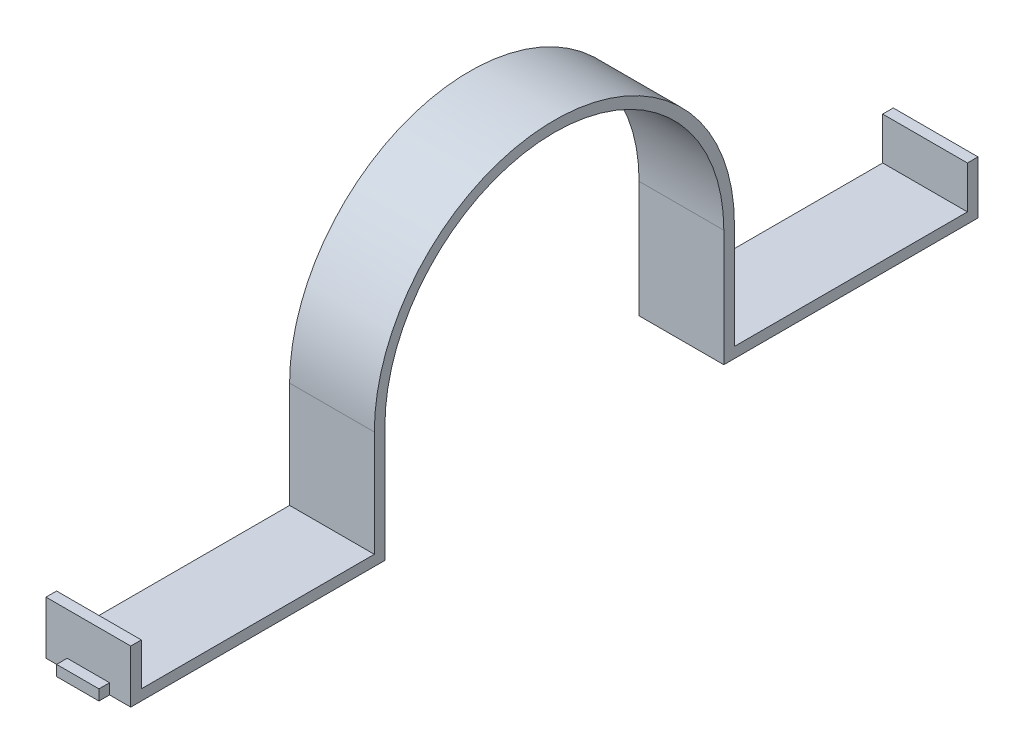
ISO-10303-21;
HEADER;
FILE_DESCRIPTION(('STEP AP214'),'2;1');
FILE_NAME('part.step','',(''),(''),'','','');
FILE_SCHEMA(('AUTOMOTIVE_DESIGN { 1 0 10303 214 1 1 1 1 }'));
ENDSEC;
DATA;
#1=APPLICATION_CONTEXT('core data for automotive mechanical design processes');
#2=APPLICATION_PROTOCOL_DEFINITION('international standard','automotive_design',2000,#1);
#3=PRODUCT_CONTEXT('',#1,'mechanical');
#4=PRODUCT('Part','Part','',(#3));
#5=PRODUCT_RELATED_PRODUCT_CATEGORY('part','',(#4));
#6=PRODUCT_DEFINITION_FORMATION('','',#4);
#7=PRODUCT_DEFINITION_CONTEXT('part definition',#1,'design');
#8=PRODUCT_DEFINITION('design','',#6,#7);
#9=PRODUCT_DEFINITION_SHAPE('','',#8);
#10=(LENGTH_UNIT() NAMED_UNIT(*) SI_UNIT(.MILLI.,.METRE.));
#11=(NAMED_UNIT(*) PLANE_ANGLE_UNIT() SI_UNIT($,.RADIAN.));
#12=(NAMED_UNIT(*) SI_UNIT($,.STERADIAN.) SOLID_ANGLE_UNIT());
#13=UNCERTAINTY_MEASURE_WITH_UNIT(LENGTH_MEASURE(1.E-05),#10,'distance_accuracy_value','');
#14=(GEOMETRIC_REPRESENTATION_CONTEXT(3) GLOBAL_UNCERTAINTY_ASSIGNED_CONTEXT((#13)) GLOBAL_UNIT_ASSIGNED_CONTEXT((#10,
#11,#12)) REPRESENTATION_CONTEXT('',''));
#15=CARTESIAN_POINT('',(0.,0.,0.));
#16=DIRECTION('',(0.,0.,1.));
#17=DIRECTION('',(1.,0.,0.));
#18=AXIS2_PLACEMENT_3D('',#15,#16,#17);
#19=CARTESIAN_POINT('',(-25.4,-63.5,254.002));
#20=DIRECTION('',(0.,-1.,0.));
#21=DIRECTION('',(0.,0.,-1.));
#22=AXIS2_PLACEMENT_3D('',#19,#20,#21);
#23=PLANE('',#22);
#24=DIRECTION('',(0.,0.,-1.));
#25=VECTOR('',#24,1.);
#26=CARTESIAN_POINT('',(25.4,-63.5,254.002));
#27=LINE('',#26,#25);
#28=CARTESIAN_POINT('',(25.4,-63.5,-107.95));
#29=VERTEX_POINT('',#28);
#30=CARTESIAN_POINT('',(25.4,-63.5,-247.65));
#31=VERTEX_POINT('',#30);
#32=EDGE_CURVE('E55',#29,#31,#27,.T.);
#33=ORIENTED_EDGE('',*,*,#32,.T.);
#34=DIRECTION('',(-1.,0.,0.));
#35=VECTOR('',#34,1.);
#36=CARTESIAN_POINT('',(-25.4,-63.5,-247.65));
#37=LINE('',#36,#35);
#38=CARTESIAN_POINT('',(-25.4,-63.5,-247.65));
#39=VERTEX_POINT('',#38);
#40=EDGE_CURVE('E50',#31,#39,#37,.T.);
#41=ORIENTED_EDGE('',*,*,#40,.T.);
#42=DIRECTION('',(0.,0.,-1.));
#43=VECTOR('',#42,1.);
#44=CARTESIAN_POINT('',(-25.4,-63.5,254.002));
#45=LINE('',#44,#43);
#46=CARTESIAN_POINT('',(-25.4,-63.5,-107.95));
#47=VERTEX_POINT('',#46);
#48=EDGE_CURVE('E203',#47,#39,#45,.T.);
#49=ORIENTED_EDGE('',*,*,#48,.F.);
#50=DIRECTION('',(-1.,0.,0.));
#51=VECTOR('',#50,1.);
#52=CARTESIAN_POINT('',(-25.4,-63.5,-107.95));
#53=LINE('',#52,#51);
#54=EDGE_CURVE('E296',#29,#47,#53,.T.);
#55=ORIENTED_EDGE('',*,*,#54,.F.);
#56=EDGE_LOOP('',(#33,#41,#49,#55));
#57=FACE_BOUND('',#56,.T.);
#58=ADVANCED_FACE('F35',(#57),#23,.F.);
#59=CARTESIAN_POINT('',(-25.4,-63.5,-107.952));
#60=DIRECTION('',(0.,1.,0.));
#61=DIRECTION('',(0.,0.,1.));
#62=AXIS2_PLACEMENT_3D('',#59,#60,#61);
#63=PLANE('',#62);
#64=DIRECTION('',(0.,0.,-1.));
#65=VECTOR('',#64,1.);
#66=CARTESIAN_POINT('',(12.7,-63.5,254.));
#67=LINE('',#66,#65);
#68=CARTESIAN_POINT('',(12.7,-63.5,260.35));
#69=VERTEX_POINT('',#68);
#70=CARTESIAN_POINT('',(12.7,-63.5,254.));
#71=VERTEX_POINT('',#70);
#72=EDGE_CURVE('E283',#69,#71,#67,.T.);
#73=ORIENTED_EDGE('',*,*,#72,.T.);
#74=DIRECTION('',(-1.,0.,0.));
#75=VECTOR('',#74,1.);
#76=CARTESIAN_POINT('',(-25.4,-63.5,254.));
#77=LINE('',#76,#75);
#78=CARTESIAN_POINT('',(-12.7,-63.5,254.));
#79=VERTEX_POINT('',#78);
#80=EDGE_CURVE('E11',#71,#79,#77,.T.);
#81=ORIENTED_EDGE('',*,*,#80,.T.);
#82=DIRECTION('',(0.,0.,1.));
#83=VECTOR('',#82,1.);
#84=CARTESIAN_POINT('',(-12.7,-63.5,254.));
#85=LINE('',#84,#83);
#86=CARTESIAN_POINT('',(-12.7,-63.5,260.35));
#87=VERTEX_POINT('',#86);
#88=EDGE_CURVE('E255',#79,#87,#85,.T.);
#89=ORIENTED_EDGE('',*,*,#88,.T.);
#90=DIRECTION('',(1.,0.,0.));
#91=VECTOR('',#90,1.);
#92=CARTESIAN_POINT('',(-12.7,-63.5,260.35));
#93=LINE('',#92,#91);
#94=EDGE_CURVE('E280',#87,#69,#93,.T.);
#95=ORIENTED_EDGE('',*,*,#94,.T.);
#96=EDGE_LOOP('',(#73,#81,#89,#95));
#97=FACE_BOUND('',#96,.T.);
#98=ADVANCED_FACE('F452',(#97),#63,.T.);
#99=DIRECTION('',(0.,0.,1.));
#100=VECTOR('',#99,1.);
#101=CARTESIAN_POINT('',(-25.4,-63.5,-107.952));
#102=LINE('',#101,#100);
#103=CARTESIAN_POINT('',(-25.4,-63.5,107.95));
#104=VERTEX_POINT('',#103);
#105=CARTESIAN_POINT('',(-25.4,-63.5,247.65));
#106=VERTEX_POINT('',#105);
#107=EDGE_CURVE('E322',#104,#106,#102,.T.);
#108=ORIENTED_EDGE('',*,*,#107,.T.);
#109=DIRECTION('',(-1.,0.,0.));
#110=VECTOR('',#109,1.);
#111=CARTESIAN_POINT('',(-25.4,-63.5,247.65));
#112=LINE('',#111,#110);
#113=CARTESIAN_POINT('',(25.4,-63.5,247.65));
#114=VERTEX_POINT('',#113);
#115=EDGE_CURVE('E206',#114,#106,#112,.T.);
#116=ORIENTED_EDGE('',*,*,#115,.F.);
#117=DIRECTION('',(0.,0.,1.));
#118=VECTOR('',#117,1.);
#119=CARTESIAN_POINT('',(25.4,-63.5,-107.952));
#120=LINE('',#119,#118);
#121=CARTESIAN_POINT('',(25.4,-63.5,107.95));
#122=VERTEX_POINT('',#121);
#123=EDGE_CURVE('E312',#122,#114,#120,.T.);
#124=ORIENTED_EDGE('',*,*,#123,.F.);
#125=DIRECTION('',(-1.,0.,0.));
#126=VECTOR('',#125,1.);
#127=CARTESIAN_POINT('',(-25.4,-63.5,107.95));
#128=LINE('',#127,#126);
#129=EDGE_CURVE('E299',#122,#104,#128,.T.);
#130=ORIENTED_EDGE('',*,*,#129,.T.);
#131=EDGE_LOOP('',(#108,#116,#124,#130));
#132=FACE_BOUND('',#131,.T.);
#133=ADVANCED_FACE('F438',(#132),#63,.T.);
#134=CARTESIAN_POINT('',(25.4,-69.85,-107.95));
#135=DIRECTION('',(0.,0.,1.));
#136=DIRECTION('',(0.,-1.,0.));
#137=AXIS2_PLACEMENT_3D('',#134,#135,#136);
#138=PLANE('',#137);
#139=ORIENTED_EDGE('',*,*,#54,.T.);
#140=DIRECTION('',(0.,1.,0.));
#141=VECTOR('',#140,1.);
#142=CARTESIAN_POINT('',(-25.4,-69.85,-107.95));
#143=LINE('',#142,#141);
#144=CARTESIAN_POINT('',(-25.4,0.,-107.95));
#145=VERTEX_POINT('',#144);
#146=EDGE_CURVE('E354',#47,#145,#143,.T.);
#147=ORIENTED_EDGE('',*,*,#146,.T.);
#148=DIRECTION('',(-1.,0.,0.));
#149=VECTOR('',#148,1.);
#150=CARTESIAN_POINT('',(25.4,0.,-107.95));
#151=LINE('',#150,#149);
#152=CARTESIAN_POINT('',(25.4,0.,-107.95));
#153=VERTEX_POINT('',#152);
#154=EDGE_CURVE('E371',#153,#145,#151,.T.);
#155=ORIENTED_EDGE('',*,*,#154,.F.);
#156=DIRECTION('',(0.,1.,0.));
#157=VECTOR('',#156,1.);
#158=CARTESIAN_POINT('',(25.4,-69.85,-107.95));
#159=LINE('',#158,#157);
#160=EDGE_CURVE('E336',#29,#153,#159,.T.);
#161=ORIENTED_EDGE('',*,*,#160,.F.);
#162=EDGE_LOOP('',(#139,#147,#155,#161));
#163=FACE_BOUND('',#162,.T.);
#164=ADVANCED_FACE('F450',(#163),#138,.F.);
#165=CARTESIAN_POINT('',(25.4,0.,0.));
#166=DIRECTION('',(-1.,0.,0.));
#167=DIRECTION('',(0.,0.,1.));
#168=AXIS2_PLACEMENT_3D('',#165,#166,#167);
#169=CYLINDRICAL_SURFACE('',#168,101.6);
#170=CARTESIAN_POINT('',(-25.4,0.,0.));
#171=DIRECTION('',(-1.,0.,0.));
#172=DIRECTION('',(0.,0.,1.));
#173=AXIS2_PLACEMENT_3D('',#170,#171,#172);
#174=CIRCLE('',#173,101.6);
#175=CARTESIAN_POINT('',(-25.4,0.,101.6));
#176=VERTEX_POINT('',#175);
#177=CARTESIAN_POINT('',(-25.4,0.,-101.6));
#178=VERTEX_POINT('',#177);
#179=EDGE_CURVE('E316',#176,#178,#174,.T.);
#180=ORIENTED_EDGE('',*,*,#179,.T.);
#181=DIRECTION('',(-1.,0.,0.));
#182=VECTOR('',#181,1.);
#183=CARTESIAN_POINT('',(25.4,0.,-101.6));
#184=LINE('',#183,#182);
#185=CARTESIAN_POINT('',(25.4,0.,-101.6));
#186=VERTEX_POINT('',#185);
#187=EDGE_CURVE('E43',#186,#178,#184,.T.);
#188=ORIENTED_EDGE('',*,*,#187,.F.);
#189=CARTESIAN_POINT('',(25.4,0.,0.));
#190=DIRECTION('',(-1.,0.,0.));
#191=DIRECTION('',(0.,0.,1.));
#192=AXIS2_PLACEMENT_3D('',#189,#190,#191);
#193=CIRCLE('',#192,101.6);
#194=CARTESIAN_POINT('',(25.4,0.,101.6));
#195=VERTEX_POINT('',#194);
#196=EDGE_CURVE('E327',#195,#186,#193,.T.);
#197=ORIENTED_EDGE('',*,*,#196,.F.);
#198=DIRECTION('',(-1.,0.,0.));
#199=VECTOR('',#198,1.);
#200=CARTESIAN_POINT('',(25.4,0.,101.6));
#201=LINE('',#200,#199);
#202=EDGE_CURVE('E347',#195,#176,#201,.T.);
#203=ORIENTED_EDGE('',*,*,#202,.T.);
#204=EDGE_LOOP('',(#180,#188,#197,#203));
#205=FACE_BOUND('',#204,.T.);
#206=ADVANCED_FACE('F37',(#205),#169,.F.);
#207=CARTESIAN_POINT('',(25.4,0.,-101.6));
#208=DIRECTION('',(0.,0.,-1.));
#209=DIRECTION('',(0.,1.,0.));
#210=AXIS2_PLACEMENT_3D('',#207,#208,#209);
#211=PLANE('',#210);
#212=DIRECTION('',(0.,-1.,0.));
#213=VECTOR('',#212,1.);
#214=CARTESIAN_POINT('',(-25.4,0.,-101.6));
#215=LINE('',#214,#213);
#216=CARTESIAN_POINT('',(-25.4,-69.85,-101.6));
#217=VERTEX_POINT('',#216);
#218=EDGE_CURVE('E350',#178,#217,#215,.T.);
#219=ORIENTED_EDGE('',*,*,#218,.T.);
#220=DIRECTION('',(-1.,0.,0.));
#221=VECTOR('',#220,1.);
#222=CARTESIAN_POINT('',(25.4,-69.85,-101.6));
#223=LINE('',#222,#221);
#224=CARTESIAN_POINT('',(25.4,-69.85,-101.6));
#225=VERTEX_POINT('',#224);
#226=EDGE_CURVE('E374',#225,#217,#223,.T.);
#227=ORIENTED_EDGE('',*,*,#226,.F.);
#228=DIRECTION('',(0.,-1.,0.));
#229=VECTOR('',#228,1.);
#230=CARTESIAN_POINT('',(25.4,0.,-101.6));
#231=LINE('',#230,#229);
#232=EDGE_CURVE('E330',#186,#225,#231,.T.);
#233=ORIENTED_EDGE('',*,*,#232,.F.);
#234=ORIENTED_EDGE('',*,*,#187,.T.);
#235=EDGE_LOOP('',(#219,#227,#233,#234));
#236=FACE_BOUND('',#235,.T.);
#237=ADVANCED_FACE('F379',(#236),#211,.F.);
#238=CARTESIAN_POINT('',(25.4,-69.85,-101.6));
#239=DIRECTION('',(0.,1.,0.));
#240=DIRECTION('',(0.,0.,1.));
#241=AXIS2_PLACEMENT_3D('',#238,#239,#240);
#242=PLANE('',#241);
#243=DIRECTION('',(0.,0.,-1.));
#244=VECTOR('',#243,1.);
#245=CARTESIAN_POINT('',(-25.4,-69.85,-101.6));
#246=LINE('',#245,#244);
#247=CARTESIAN_POINT('',(-25.4,-69.85,-254.));
#248=VERTEX_POINT('',#247);
#249=EDGE_CURVE('E352',#217,#248,#246,.T.);
#250=ORIENTED_EDGE('',*,*,#249,.T.);
#251=DIRECTION('',(1.,0.,0.));
#252=VECTOR('',#251,1.);
#253=CARTESIAN_POINT('',(-25.4,-69.85,-254.));
#254=LINE('',#253,#252);
#255=CARTESIAN_POINT('',(-12.7,-69.85,-254.));
#256=VERTEX_POINT('',#255);
#257=EDGE_CURVE('E302',#248,#256,#254,.T.);
#258=ORIENTED_EDGE('',*,*,#257,.T.);
#259=DIRECTION('',(0.,0.,1.));
#260=VECTOR('',#259,1.);
#261=CARTESIAN_POINT('',(-12.7,-69.85,-254.));
#262=LINE('',#261,#260);
#263=CARTESIAN_POINT('',(-12.7,-69.85,-260.35));
#264=VERTEX_POINT('',#263);
#265=EDGE_CURVE('E253',#264,#256,#262,.T.);
#266=ORIENTED_EDGE('',*,*,#265,.F.);
#267=DIRECTION('',(-1.,0.,0.));
#268=VECTOR('',#267,1.);
#269=CARTESIAN_POINT('',(-12.7,-69.85,-260.35));
#270=LINE('',#269,#268);
#271=CARTESIAN_POINT('',(12.7,-69.85,-260.35));
#272=VERTEX_POINT('',#271);
#273=EDGE_CURVE('E249',#272,#264,#270,.T.);
#274=ORIENTED_EDGE('',*,*,#273,.F.);
#275=DIRECTION('',(0.,0.,-1.));
#276=VECTOR('',#275,1.);
#277=CARTESIAN_POINT('',(12.7,-69.85,-254.));
#278=LINE('',#277,#276);
#279=CARTESIAN_POINT('',(12.7,-69.85,-254.));
#280=VERTEX_POINT('',#279);
#281=EDGE_CURVE('E246',#280,#272,#278,.T.);
#282=ORIENTED_EDGE('',*,*,#281,.F.);
#283=CARTESIAN_POINT('',(25.4,-69.85,-254.));
#284=VERTEX_POINT('',#283);
#285=EDGE_CURVE('E305',#280,#284,#254,.T.);
#286=ORIENTED_EDGE('',*,*,#285,.T.);
#287=DIRECTION('',(0.,0.,-1.));
#288=VECTOR('',#287,1.);
#289=CARTESIAN_POINT('',(25.4,-69.85,-101.6));
#290=LINE('',#289,#288);
#291=EDGE_CURVE('E333',#225,#284,#290,.T.);
#292=ORIENTED_EDGE('',*,*,#291,.F.);
#293=ORIENTED_EDGE('',*,*,#226,.T.);
#294=EDGE_LOOP('',(#250,#258,#266,#274,#282,#286,#292,#293));
#295=FACE_BOUND('',#294,.T.);
#296=ADVANCED_FACE('F388',(#295),#242,.F.);
#297=CARTESIAN_POINT('',(25.4,0.,0.));
#298=DIRECTION('',(-1.,0.,0.));
#299=DIRECTION('',(0.,0.,1.));
#300=AXIS2_PLACEMENT_3D('',#297,#298,#299);
#301=CYLINDRICAL_SURFACE('',#300,107.95);
#302=CARTESIAN_POINT('',(-25.4,0.,0.));
#303=DIRECTION('',(1.,0.,0.));
#304=DIRECTION('',(0.,0.,1.));
#305=AXIS2_PLACEMENT_3D('',#302,#303,#304);
#306=CIRCLE('',#305,107.95);
#307=CARTESIAN_POINT('',(-25.4,0.,107.95));
#308=VERTEX_POINT('',#307);
#309=EDGE_CURVE('E356',#145,#308,#306,.T.);
#310=ORIENTED_EDGE('',*,*,#309,.T.);
#311=DIRECTION('',(-1.,0.,0.));
#312=VECTOR('',#311,1.);
#313=CARTESIAN_POINT('',(25.4,0.,107.95));
#314=LINE('',#313,#312);
#315=CARTESIAN_POINT('',(25.4,0.,107.95));
#316=VERTEX_POINT('',#315);
#317=EDGE_CURVE('E368',#316,#308,#314,.T.);
#318=ORIENTED_EDGE('',*,*,#317,.F.);
#319=CARTESIAN_POINT('',(25.4,0.,0.));
#320=DIRECTION('',(1.,0.,0.));
#321=DIRECTION('',(0.,0.,1.));
#322=AXIS2_PLACEMENT_3D('',#319,#320,#321);
#323=CIRCLE('',#322,107.95);
#324=EDGE_CURVE('E338',#153,#316,#323,.T.);
#325=ORIENTED_EDGE('',*,*,#324,.F.);
#326=ORIENTED_EDGE('',*,*,#154,.T.);
#327=EDGE_LOOP('',(#310,#318,#325,#326));
#328=FACE_BOUND('',#327,.T.);
#329=ADVANCED_FACE('F447',(#328),#301,.T.);
#330=CARTESIAN_POINT('',(25.4,0.,107.95));
#331=DIRECTION('',(0.,0.,-1.));
#332=DIRECTION('',(-1.,0.,0.));
#333=AXIS2_PLACEMENT_3D('',#330,#331,#332);
#334=PLANE('',#333);
#335=DIRECTION('',(0.,-1.,0.));
#336=VECTOR('',#335,1.);
#337=CARTESIAN_POINT('',(-25.4,0.,107.95));
#338=LINE('',#337,#336);
#339=EDGE_CURVE('E358',#308,#104,#338,.T.);
#340=ORIENTED_EDGE('',*,*,#339,.T.);
#341=ORIENTED_EDGE('',*,*,#129,.F.);
#342=DIRECTION('',(0.,-1.,0.));
#343=VECTOR('',#342,1.);
#344=CARTESIAN_POINT('',(25.4,0.,107.95));
#345=LINE('',#344,#343);
#346=EDGE_CURVE('E340',#316,#122,#345,.T.);
#347=ORIENTED_EDGE('',*,*,#346,.F.);
#348=ORIENTED_EDGE('',*,*,#317,.T.);
#349=EDGE_LOOP('',(#340,#341,#347,#348));
#350=FACE_BOUND('',#349,.T.);
#351=ADVANCED_FACE('F442',(#350),#334,.F.);
#352=CARTESIAN_POINT('',(25.4,-69.85,107.95));
#353=DIRECTION('',(0.,1.,0.));
#354=DIRECTION('',(0.,0.,1.));
#355=AXIS2_PLACEMENT_3D('',#352,#353,#354);
#356=PLANE('',#355);
#357=DIRECTION('',(0.,0.,-1.));
#358=VECTOR('',#357,1.);
#359=CARTESIAN_POINT('',(-25.4,-69.85,107.95));
#360=LINE('',#359,#358);
#361=CARTESIAN_POINT('',(-25.4,-69.85,254.));
#362=VERTEX_POINT('',#361);
#363=CARTESIAN_POINT('',(-25.4,-69.85,101.6));
#364=VERTEX_POINT('',#363);
#365=EDGE_CURVE('E360',#362,#364,#360,.T.);
#366=ORIENTED_EDGE('',*,*,#365,.T.);
#367=DIRECTION('',(-1.,0.,0.));
#368=VECTOR('',#367,1.);
#369=CARTESIAN_POINT('',(25.4,-69.85,101.6));
#370=LINE('',#369,#368);
#371=CARTESIAN_POINT('',(25.4,-69.85,101.6));
#372=VERTEX_POINT('',#371);
#373=EDGE_CURVE('E365',#372,#364,#370,.T.);
#374=ORIENTED_EDGE('',*,*,#373,.F.);
#375=DIRECTION('',(0.,0.,-1.));
#376=VECTOR('',#375,1.);
#377=CARTESIAN_POINT('',(25.4,-69.85,107.95));
#378=LINE('',#377,#376);
#379=CARTESIAN_POINT('',(25.4,-69.85,254.));
#380=VERTEX_POINT('',#379);
#381=EDGE_CURVE('E343',#380,#372,#378,.T.);
#382=ORIENTED_EDGE('',*,*,#381,.F.);
#383=DIRECTION('',(1.,0.,0.));
#384=VECTOR('',#383,1.);
#385=CARTESIAN_POINT('',(-25.4,-69.85,254.));
#386=LINE('',#385,#384);
#387=CARTESIAN_POINT('',(12.7,-69.85,254.));
#388=VERTEX_POINT('',#387);
#389=EDGE_CURVE('E321',#388,#380,#386,.T.);
#390=ORIENTED_EDGE('',*,*,#389,.F.);
#391=DIRECTION('',(0.,0.,1.));
#392=VECTOR('',#391,1.);
#393=CARTESIAN_POINT('',(12.7,-69.85,254.));
#394=LINE('',#393,#392);
#395=CARTESIAN_POINT('',(12.7,-69.85,260.35));
#396=VERTEX_POINT('',#395);
#397=EDGE_CURVE('E271',#388,#396,#394,.T.);
#398=ORIENTED_EDGE('',*,*,#397,.T.);
#399=DIRECTION('',(-1.,0.,0.));
#400=VECTOR('',#399,1.);
#401=CARTESIAN_POINT('',(-12.7,-69.85,260.35));
#402=LINE('',#401,#400);
#403=CARTESIAN_POINT('',(-12.7,-69.85,260.35));
#404=VERTEX_POINT('',#403);
#405=EDGE_CURVE('E277',#396,#404,#402,.T.);
#406=ORIENTED_EDGE('',*,*,#405,.T.);
#407=DIRECTION('',(0.,0.,-1.));
#408=VECTOR('',#407,1.);
#409=CARTESIAN_POINT('',(-12.7,-69.85,254.));
#410=LINE('',#409,#408);
#411=CARTESIAN_POINT('',(-12.7,-69.85,254.));
#412=VERTEX_POINT('',#411);
#413=EDGE_CURVE('E273',#404,#412,#410,.T.);
#414=ORIENTED_EDGE('',*,*,#413,.T.);
#415=EDGE_CURVE('E319',#362,#412,#386,.T.);
#416=ORIENTED_EDGE('',*,*,#415,.F.);
#417=EDGE_LOOP('',(#366,#374,#382,#390,#398,#406,#414,#416));
#418=FACE_BOUND('',#417,.T.);
#419=ADVANCED_FACE('F419',(#418),#356,.F.);
#420=CARTESIAN_POINT('',(25.4,-69.85,101.6));
#421=DIRECTION('',(0.,0.,1.));
#422=DIRECTION('',(0.,-1.,0.));
#423=AXIS2_PLACEMENT_3D('',#420,#421,#422);
#424=PLANE('',#423);
#425=DIRECTION('',(0.,1.,0.));
#426=VECTOR('',#425,1.);
#427=CARTESIAN_POINT('',(-25.4,-69.85,101.6));
#428=LINE('',#427,#426);
#429=EDGE_CURVE('E331',#364,#176,#428,.T.);
#430=ORIENTED_EDGE('',*,*,#429,.T.);
#431=ORIENTED_EDGE('',*,*,#202,.F.);
#432=DIRECTION('',(0.,1.,0.));
#433=VECTOR('',#432,1.);
#434=CARTESIAN_POINT('',(25.4,-69.85,101.6));
#435=LINE('',#434,#433);
#436=EDGE_CURVE('E345',#372,#195,#435,.T.);
#437=ORIENTED_EDGE('',*,*,#436,.F.);
#438=ORIENTED_EDGE('',*,*,#373,.T.);
#439=EDGE_LOOP('',(#430,#431,#437,#438));
#440=FACE_BOUND('',#439,.T.);
#441=ADVANCED_FACE('F417',(#440),#424,.F.);
#442=CARTESIAN_POINT('',(25.4,0.,0.));
#443=DIRECTION('',(-1.,0.,0.));
#444=DIRECTION('',(0.,0.,1.));
#445=AXIS2_PLACEMENT_3D('',#442,#443,#444);
#446=PLANE('',#445);
#447=ORIENTED_EDGE('',*,*,#196,.T.);
#448=ORIENTED_EDGE('',*,*,#232,.T.);
#449=ORIENTED_EDGE('',*,*,#291,.T.);
#450=DIRECTION('',(0.,1.,0.));
#451=VECTOR('',#450,1.);
#452=CARTESIAN_POINT('',(25.4,-69.85,-254.));
#453=LINE('',#452,#451);
#454=CARTESIAN_POINT('',(25.4,-38.1,-254.));
#455=VERTEX_POINT('',#454);
#456=EDGE_CURVE('E300',#284,#455,#453,.T.);
#457=ORIENTED_EDGE('',*,*,#456,.T.);
#458=DIRECTION('',(0.,0.,1.));
#459=VECTOR('',#458,1.);
#460=CARTESIAN_POINT('',(25.4,-38.1,-254.));
#461=LINE('',#460,#459);
#462=CARTESIAN_POINT('',(25.4,-38.1,-247.65));
#463=VERTEX_POINT('',#462);
#464=EDGE_CURVE('E220',#455,#463,#461,.T.);
#465=ORIENTED_EDGE('',*,*,#464,.T.);
#466=DIRECTION('',(0.,-1.,0.));
#467=VECTOR('',#466,1.);
#468=CARTESIAN_POINT('',(25.4,-38.1,-247.65));
#469=LINE('',#468,#467);
#470=EDGE_CURVE('E207',#463,#31,#469,.T.);
#471=ORIENTED_EDGE('',*,*,#470,.T.);
#472=ORIENTED_EDGE('',*,*,#32,.F.);
#473=ORIENTED_EDGE('',*,*,#160,.T.);
#474=ORIENTED_EDGE('',*,*,#324,.T.);
#475=ORIENTED_EDGE('',*,*,#346,.T.);
#476=ORIENTED_EDGE('',*,*,#123,.T.);
#477=DIRECTION('',(0.,-1.,0.));
#478=VECTOR('',#477,1.);
#479=CARTESIAN_POINT('',(25.4,-38.1,247.65));
#480=LINE('',#479,#478);
#481=CARTESIAN_POINT('',(25.4,-38.1,247.65));
#482=VERTEX_POINT('',#481);
#483=EDGE_CURVE('E243',#482,#114,#480,.T.);
#484=ORIENTED_EDGE('',*,*,#483,.F.);
#485=DIRECTION('',(0.,0.,-1.));
#486=VECTOR('',#485,1.);
#487=CARTESIAN_POINT('',(25.4,-38.1,254.));
#488=LINE('',#487,#486);
#489=CARTESIAN_POINT('',(25.4,-38.1,254.));
#490=VERTEX_POINT('',#489);
#491=EDGE_CURVE('E235',#490,#482,#488,.T.);
#492=ORIENTED_EDGE('',*,*,#491,.F.);
#493=DIRECTION('',(0.,1.,0.));
#494=VECTOR('',#493,1.);
#495=CARTESIAN_POINT('',(25.4,-69.85,254.));
#496=LINE('',#495,#494);
#497=EDGE_CURVE('E317',#380,#490,#496,.T.);
#498=ORIENTED_EDGE('',*,*,#497,.F.);
#499=ORIENTED_EDGE('',*,*,#381,.T.);
#500=ORIENTED_EDGE('',*,*,#436,.T.);
#501=EDGE_LOOP('',(#447,#448,#449,#457,#465,#471,#472,#473,#474,#475,#476,#484,#492,#498,#499,#500));
#502=FACE_BOUND('',#501,.T.);
#503=ADVANCED_FACE('F411',(#502),#446,.F.);
#504=CARTESIAN_POINT('',(-25.4,0.,0.));
#505=DIRECTION('',(-1.,0.,0.));
#506=DIRECTION('',(0.,0.,1.));
#507=AXIS2_PLACEMENT_3D('',#504,#505,#506);
#508=PLANE('',#507);
#509=ORIENTED_EDGE('',*,*,#179,.F.);
#510=ORIENTED_EDGE('',*,*,#429,.F.);
#511=ORIENTED_EDGE('',*,*,#365,.F.);
#512=DIRECTION('',(0.,-1.,0.));
#513=VECTOR('',#512,1.);
#514=CARTESIAN_POINT('',(-25.4,-69.85,254.));
#515=LINE('',#514,#513);
#516=CARTESIAN_POINT('',(-25.4,-38.1,254.));
#517=VERTEX_POINT('',#516);
#518=EDGE_CURVE('E313',#517,#362,#515,.T.);
#519=ORIENTED_EDGE('',*,*,#518,.F.);
#520=DIRECTION('',(0.,0.,1.));
#521=VECTOR('',#520,1.);
#522=CARTESIAN_POINT('',(-25.4,-38.1,254.));
#523=LINE('',#522,#521);
#524=CARTESIAN_POINT('',(-25.4,-38.1,247.65));
#525=VERTEX_POINT('',#524);
#526=EDGE_CURVE('E229',#525,#517,#523,.T.);
#527=ORIENTED_EDGE('',*,*,#526,.F.);
#528=DIRECTION('',(0.,-1.,0.));
#529=VECTOR('',#528,1.);
#530=CARTESIAN_POINT('',(-25.4,-38.1,247.65));
#531=LINE('',#530,#529);
#532=EDGE_CURVE('E239',#525,#106,#531,.T.);
#533=ORIENTED_EDGE('',*,*,#532,.T.);
#534=ORIENTED_EDGE('',*,*,#107,.F.);
#535=ORIENTED_EDGE('',*,*,#339,.F.);
#536=ORIENTED_EDGE('',*,*,#309,.F.);
#537=ORIENTED_EDGE('',*,*,#146,.F.);
#538=ORIENTED_EDGE('',*,*,#48,.T.);
#539=DIRECTION('',(0.,-1.,0.));
#540=VECTOR('',#539,1.);
#541=CARTESIAN_POINT('',(-25.4,-38.1,-247.65));
#542=LINE('',#541,#540);
#543=CARTESIAN_POINT('',(-25.4,-38.1,-247.65));
#544=VERTEX_POINT('',#543);
#545=EDGE_CURVE('E196',#544,#39,#542,.T.);
#546=ORIENTED_EDGE('',*,*,#545,.F.);
#547=DIRECTION('',(0.,0.,-1.));
#548=VECTOR('',#547,1.);
#549=CARTESIAN_POINT('',(-25.4,-38.1,-254.));
#550=LINE('',#549,#548);
#551=CARTESIAN_POINT('',(-25.4,-38.1,-254.));
#552=VERTEX_POINT('',#551);
#553=EDGE_CURVE('E201',#544,#552,#550,.T.);
#554=ORIENTED_EDGE('',*,*,#553,.T.);
#555=DIRECTION('',(0.,-1.,0.));
#556=VECTOR('',#555,1.);
#557=CARTESIAN_POINT('',(-25.4,-69.85,-254.));
#558=LINE('',#557,#556);
#559=EDGE_CURVE('E297',#552,#248,#558,.T.);
#560=ORIENTED_EDGE('',*,*,#559,.T.);
#561=ORIENTED_EDGE('',*,*,#249,.F.);
#562=ORIENTED_EDGE('',*,*,#218,.F.);
#563=EDGE_LOOP('',(#509,#510,#511,#519,#527,#533,#534,#535,#536,#537,#538,#546,#554,#560,#561,#562));
#564=FACE_BOUND('',#563,.T.);
#565=ADVANCED_FACE('F199',(#564),#508,.T.);
#566=CARTESIAN_POINT('',(0.,0.,254.));
#567=DIRECTION('',(0.,0.,-1.));
#568=DIRECTION('',(-1.,0.,0.));
#569=AXIS2_PLACEMENT_3D('',#566,#567,#568);
#570=PLANE('',#569);
#571=ORIENTED_EDGE('',*,*,#415,.T.);
#572=DIRECTION('',(0.,1.,0.));
#573=VECTOR('',#572,1.);
#574=CARTESIAN_POINT('',(-12.7,-96.0317207226722,254.));
#575=LINE('',#574,#573);
#576=EDGE_CURVE('E274',#412,#79,#575,.T.);
#577=ORIENTED_EDGE('',*,*,#576,.T.);
#578=ORIENTED_EDGE('',*,*,#80,.F.);
#579=DIRECTION('',(0.,1.,0.));
#580=VECTOR('',#579,1.);
#581=CARTESIAN_POINT('',(12.7,-96.0317207226722,254.));
#582=LINE('',#581,#580);
#583=EDGE_CURVE('E289',#388,#71,#582,.T.);
#584=ORIENTED_EDGE('',*,*,#583,.F.);
#585=ORIENTED_EDGE('',*,*,#389,.T.);
#586=ORIENTED_EDGE('',*,*,#497,.T.);
#587=DIRECTION('',(1.,0.,0.));
#588=VECTOR('',#587,1.);
#589=CARTESIAN_POINT('',(-25.4,-38.1,254.));
#590=LINE('',#589,#588);
#591=EDGE_CURVE('E232',#517,#490,#590,.T.);
#592=ORIENTED_EDGE('',*,*,#591,.F.);
#593=ORIENTED_EDGE('',*,*,#518,.T.);
#594=EDGE_LOOP('',(#571,#577,#578,#584,#585,#586,#592,#593));
#595=FACE_BOUND('',#594,.T.);
#596=ADVANCED_FACE('F425',(#595),#570,.F.);
#597=DIRECTION('',(0.,0.,-1.));
#598=VECTOR('',#597,1.);
#599=CARTESIAN_POINT('',(-12.7,-63.5,-254.));
#600=LINE('',#599,#598);
#601=CARTESIAN_POINT('',(-12.7,-63.5,-254.));
#602=VERTEX_POINT('',#601);
#603=CARTESIAN_POINT('',(-12.7,-63.5,-260.35));
#604=VERTEX_POINT('',#603);
#605=EDGE_CURVE('E245',#602,#604,#600,.T.);
#606=ORIENTED_EDGE('',*,*,#605,.F.);
#607=DIRECTION('',(1.,0.,0.));
#608=VECTOR('',#607,1.);
#609=CARTESIAN_POINT('',(-25.4,-63.5,-254.));
#610=LINE('',#609,#608);
#611=CARTESIAN_POINT('',(12.7,-63.5,-254.));
#612=VERTEX_POINT('',#611);
#613=EDGE_CURVE('E217',#602,#612,#610,.T.);
#614=ORIENTED_EDGE('',*,*,#613,.T.);
#615=DIRECTION('',(0.,0.,1.));
#616=VECTOR('',#615,1.);
#617=CARTESIAN_POINT('',(12.7,-63.5,-254.));
#618=LINE('',#617,#616);
#619=CARTESIAN_POINT('',(12.7,-63.5,-260.35));
#620=VERTEX_POINT('',#619);
#621=EDGE_CURVE('E258',#620,#612,#618,.T.);
#622=ORIENTED_EDGE('',*,*,#621,.F.);
#623=DIRECTION('',(1.,0.,0.));
#624=VECTOR('',#623,1.);
#625=CARTESIAN_POINT('',(-12.7,-63.5,-260.35));
#626=LINE('',#625,#624);
#627=EDGE_CURVE('E261',#604,#620,#626,.T.);
#628=ORIENTED_EDGE('',*,*,#627,.F.);
#629=EDGE_LOOP('',(#606,#614,#622,#628));
#630=FACE_BOUND('',#629,.T.);
#631=ADVANCED_FACE('F401',(#630),#23,.F.);
#632=CARTESIAN_POINT('',(0.,0.,-254.));
#633=DIRECTION('',(0.,0.,1.));
#634=DIRECTION('',(-1.,0.,0.));
#635=AXIS2_PLACEMENT_3D('',#632,#633,#634);
#636=PLANE('',#635);
#637=ORIENTED_EDGE('',*,*,#285,.F.);
#638=DIRECTION('',(0.,1.,0.));
#639=VECTOR('',#638,1.);
#640=CARTESIAN_POINT('',(12.7,-96.0317207226722,-254.));
#641=LINE('',#640,#639);
#642=EDGE_CURVE('E268',#280,#612,#641,.T.);
#643=ORIENTED_EDGE('',*,*,#642,.T.);
#644=ORIENTED_EDGE('',*,*,#613,.F.);
#645=DIRECTION('',(0.,1.,0.));
#646=VECTOR('',#645,1.);
#647=CARTESIAN_POINT('',(-12.7,-96.0317207226722,-254.));
#648=LINE('',#647,#646);
#649=EDGE_CURVE('E264',#256,#602,#648,.T.);
#650=ORIENTED_EDGE('',*,*,#649,.F.);
#651=ORIENTED_EDGE('',*,*,#257,.F.);
#652=ORIENTED_EDGE('',*,*,#559,.F.);
#653=DIRECTION('',(1.,0.,0.));
#654=VECTOR('',#653,1.);
#655=CARTESIAN_POINT('',(-25.4,-38.1,-254.));
#656=LINE('',#655,#654);
#657=EDGE_CURVE('E216',#552,#455,#656,.T.);
#658=ORIENTED_EDGE('',*,*,#657,.T.);
#659=ORIENTED_EDGE('',*,*,#456,.F.);
#660=EDGE_LOOP('',(#637,#643,#644,#650,#651,#652,#658,#659));
#661=FACE_BOUND('',#660,.T.);
#662=ADVANCED_FACE('F393',(#661),#636,.F.);
#663=CARTESIAN_POINT('',(-12.7,-96.0317207226722,254.));
#664=DIRECTION('',(-1.,0.,0.));
#665=DIRECTION('',(0.,0.,1.));
#666=AXIS2_PLACEMENT_3D('',#663,#664,#665);
#667=PLANE('',#666);
#668=ORIENTED_EDGE('',*,*,#413,.F.);
#669=DIRECTION('',(0.,1.,0.));
#670=VECTOR('',#669,1.);
#671=CARTESIAN_POINT('',(-12.7,-96.0317207226722,260.35));
#672=LINE('',#671,#670);
#673=EDGE_CURVE('E286',#404,#87,#672,.T.);
#674=ORIENTED_EDGE('',*,*,#673,.T.);
#675=ORIENTED_EDGE('',*,*,#88,.F.);
#676=ORIENTED_EDGE('',*,*,#576,.F.);
#677=EDGE_LOOP('',(#668,#674,#675,#676));
#678=FACE_BOUND('',#677,.T.);
#679=ADVANCED_FACE('F462',(#678),#667,.T.);
#680=CARTESIAN_POINT('',(12.7,-96.0317207226722,254.));
#681=DIRECTION('',(1.,0.,0.));
#682=DIRECTION('',(0.,0.,-1.));
#683=AXIS2_PLACEMENT_3D('',#680,#681,#682);
#684=PLANE('',#683);
#685=ORIENTED_EDGE('',*,*,#397,.F.);
#686=ORIENTED_EDGE('',*,*,#583,.T.);
#687=ORIENTED_EDGE('',*,*,#72,.F.);
#688=DIRECTION('',(0.,1.,0.));
#689=VECTOR('',#688,1.);
#690=CARTESIAN_POINT('',(12.7,-96.0317207226722,260.35));
#691=LINE('',#690,#689);
#692=EDGE_CURVE('E292',#396,#69,#691,.T.);
#693=ORIENTED_EDGE('',*,*,#692,.F.);
#694=EDGE_LOOP('',(#685,#686,#687,#693));
#695=FACE_BOUND('',#694,.T.);
#696=ADVANCED_FACE('F468',(#695),#684,.T.);
#697=CARTESIAN_POINT('',(-12.7,-96.0317207226722,260.35));
#698=DIRECTION('',(0.,0.,1.));
#699=DIRECTION('',(1.,0.,0.));
#700=AXIS2_PLACEMENT_3D('',#697,#698,#699);
#701=PLANE('',#700);
#702=ORIENTED_EDGE('',*,*,#405,.F.);
#703=ORIENTED_EDGE('',*,*,#692,.T.);
#704=ORIENTED_EDGE('',*,*,#94,.F.);
#705=ORIENTED_EDGE('',*,*,#673,.F.);
#706=EDGE_LOOP('',(#702,#703,#704,#705));
#707=FACE_BOUND('',#706,.T.);
#708=ADVANCED_FACE('F474',(#707),#701,.T.);
#709=CARTESIAN_POINT('',(12.7,-96.0317207226722,-254.));
#710=DIRECTION('',(-1.,0.,0.));
#711=DIRECTION('',(0.,0.,1.));
#712=AXIS2_PLACEMENT_3D('',#709,#710,#711);
#713=PLANE('',#712);
#714=ORIENTED_EDGE('',*,*,#642,.F.);
#715=ORIENTED_EDGE('',*,*,#281,.T.);
#716=DIRECTION('',(0.,1.,0.));
#717=VECTOR('',#716,1.);
#718=CARTESIAN_POINT('',(12.7,-96.0317207226722,-260.35));
#719=LINE('',#718,#717);
#720=EDGE_CURVE('E266',#272,#620,#719,.T.);
#721=ORIENTED_EDGE('',*,*,#720,.T.);
#722=ORIENTED_EDGE('',*,*,#621,.T.);
#723=EDGE_LOOP('',(#714,#715,#721,#722));
#724=FACE_BOUND('',#723,.T.);
#725=ADVANCED_FACE('F408',(#724),#713,.F.);
#726=CARTESIAN_POINT('',(-12.7,-96.0317207226722,-260.35));
#727=DIRECTION('',(0.,0.,1.));
#728=DIRECTION('',(1.,0.,0.));
#729=AXIS2_PLACEMENT_3D('',#726,#727,#728);
#730=PLANE('',#729);
#731=ORIENTED_EDGE('',*,*,#720,.F.);
#732=ORIENTED_EDGE('',*,*,#273,.T.);
#733=DIRECTION('',(0.,1.,0.));
#734=VECTOR('',#733,1.);
#735=CARTESIAN_POINT('',(-12.7,-96.0317207226722,-260.35));
#736=LINE('',#735,#734);
#737=EDGE_CURVE('E250',#264,#604,#736,.T.);
#738=ORIENTED_EDGE('',*,*,#737,.T.);
#739=ORIENTED_EDGE('',*,*,#627,.T.);
#740=EDGE_LOOP('',(#731,#732,#738,#739));
#741=FACE_BOUND('',#740,.T.);
#742=ADVANCED_FACE('F405',(#741),#730,.F.);
#743=CARTESIAN_POINT('',(-12.7,-96.0317207226722,-254.));
#744=DIRECTION('',(1.,0.,0.));
#745=DIRECTION('',(0.,0.,-1.));
#746=AXIS2_PLACEMENT_3D('',#743,#744,#745);
#747=PLANE('',#746);
#748=ORIENTED_EDGE('',*,*,#737,.F.);
#749=ORIENTED_EDGE('',*,*,#265,.T.);
#750=ORIENTED_EDGE('',*,*,#649,.T.);
#751=ORIENTED_EDGE('',*,*,#605,.T.);
#752=EDGE_LOOP('',(#748,#749,#750,#751));
#753=FACE_BOUND('',#752,.T.);
#754=ADVANCED_FACE('F398',(#753),#747,.F.);
#755=CARTESIAN_POINT('',(-25.4,-38.1,247.65));
#756=DIRECTION('',(0.,0.,1.));
#757=DIRECTION('',(1.,0.,0.));
#758=AXIS2_PLACEMENT_3D('',#755,#756,#757);
#759=PLANE('',#758);
#760=ORIENTED_EDGE('',*,*,#115,.T.);
#761=ORIENTED_EDGE('',*,*,#532,.F.);
#762=DIRECTION('',(-1.,0.,0.));
#763=VECTOR('',#762,1.);
#764=CARTESIAN_POINT('',(-25.4,-38.1,247.65));
#765=LINE('',#764,#763);
#766=EDGE_CURVE('E237',#482,#525,#765,.T.);
#767=ORIENTED_EDGE('',*,*,#766,.F.);
#768=ORIENTED_EDGE('',*,*,#483,.T.);
#769=EDGE_LOOP('',(#760,#761,#767,#768));
#770=FACE_BOUND('',#769,.T.);
#771=ADVANCED_FACE('F433',(#770),#759,.F.);
#772=CARTESIAN_POINT('',(0.,-38.1,0.));
#773=DIRECTION('',(0.,-1.,0.));
#774=DIRECTION('',(0.,0.,-1.));
#775=AXIS2_PLACEMENT_3D('',#772,#773,#774);
#776=PLANE('',#775);
#777=ORIENTED_EDGE('',*,*,#526,.T.);
#778=ORIENTED_EDGE('',*,*,#591,.T.);
#779=ORIENTED_EDGE('',*,*,#491,.T.);
#780=ORIENTED_EDGE('',*,*,#766,.T.);
#781=EDGE_LOOP('',(#777,#778,#779,#780));
#782=FACE_BOUND('',#781,.T.);
#783=ADVANCED_FACE('F428',(#782),#776,.F.);
#784=CARTESIAN_POINT('',(-25.4,-38.1,-247.65));
#785=DIRECTION('',(0.,0.,1.));
#786=DIRECTION('',(1.,0.,0.));
#787=AXIS2_PLACEMENT_3D('',#784,#785,#786);
#788=PLANE('',#787);
#789=ORIENTED_EDGE('',*,*,#40,.F.);
#790=ORIENTED_EDGE('',*,*,#470,.F.);
#791=DIRECTION('',(-1.,0.,0.));
#792=VECTOR('',#791,1.);
#793=CARTESIAN_POINT('',(-25.4,-38.1,-247.65));
#794=LINE('',#793,#792);
#795=EDGE_CURVE('E213',#463,#544,#794,.T.);
#796=ORIENTED_EDGE('',*,*,#795,.T.);
#797=ORIENTED_EDGE('',*,*,#545,.T.);
#798=EDGE_LOOP('',(#789,#790,#796,#797));
#799=FACE_BOUND('',#798,.T.);
#800=ADVANCED_FACE('F219',(#799),#788,.T.);
#801=CARTESIAN_POINT('',(0.,-38.1,0.));
#802=DIRECTION('',(0.,-1.,0.));
#803=DIRECTION('',(0.,0.,1.));
#804=AXIS2_PLACEMENT_3D('',#801,#802,#803);
#805=PLANE('',#804);
#806=ORIENTED_EDGE('',*,*,#553,.F.);
#807=ORIENTED_EDGE('',*,*,#795,.F.);
#808=ORIENTED_EDGE('',*,*,#464,.F.);
#809=ORIENTED_EDGE('',*,*,#657,.F.);
#810=EDGE_LOOP('',(#806,#807,#808,#809));
#811=FACE_BOUND('',#810,.T.);
#812=ADVANCED_FACE('F211',(#811),#805,.F.);
#813=CLOSED_SHELL('',(#58,#98,#133,#164,#206,#237,#296,#329,#351,#419,#441,#503,#565,#596,#631,
#662,#679,#696,#708,#725,#742,#754,#771,#783,#800,#812));
#814=MANIFOLD_SOLID_BREP('B2',#813);
#815=ADVANCED_BREP_SHAPE_REPRESENTATION('',(#18,#814),#14);
#816=SHAPE_DEFINITION_REPRESENTATION(#9,#815);
ENDSEC;
END-ISO-10303-21;
